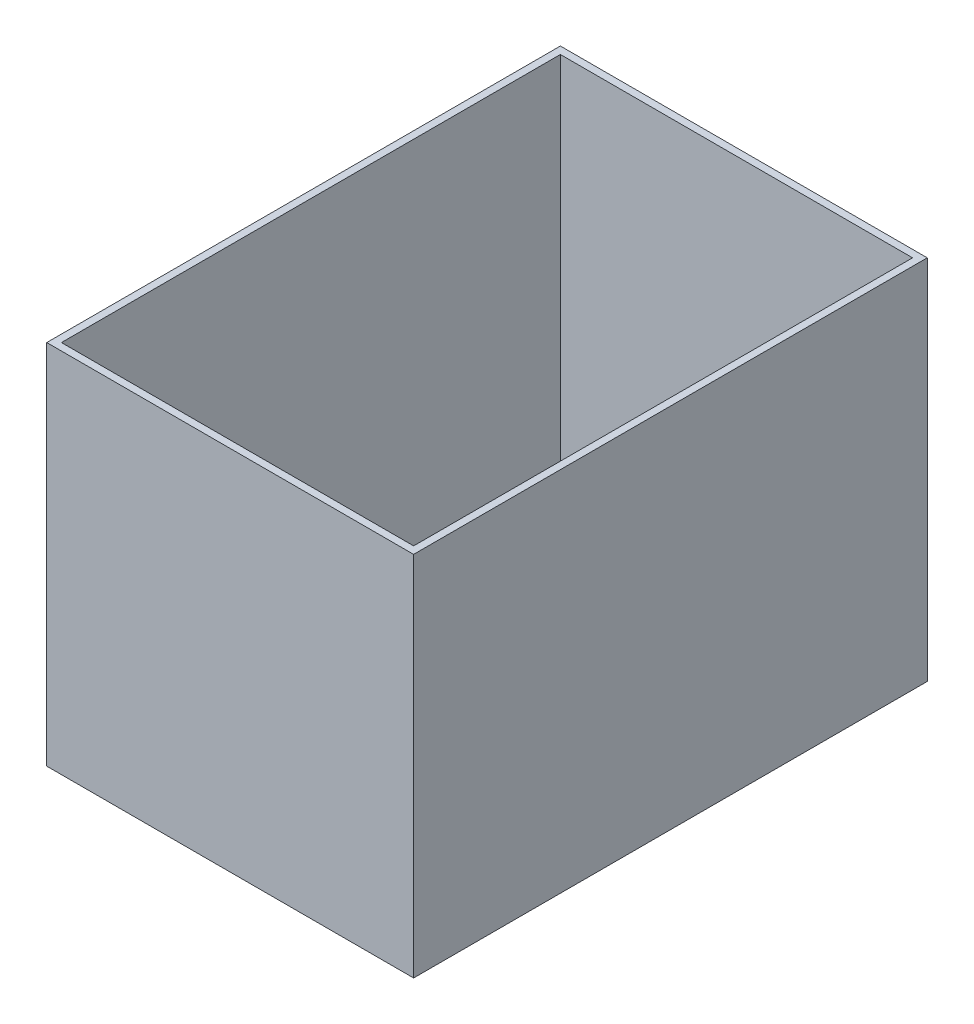
ISO-10303-21;
HEADER;
FILE_DESCRIPTION(('STEP AP214'),'2;1');
FILE_NAME('part.step','',(''),(''),'','','');
FILE_SCHEMA(('AUTOMOTIVE_DESIGN { 1 0 10303 214 1 1 1 1 }'));
ENDSEC;
DATA;
#1=APPLICATION_CONTEXT('core data for automotive mechanical design processes');
#2=APPLICATION_PROTOCOL_DEFINITION('international standard','automotive_design',2000,#1);
#3=PRODUCT_CONTEXT('',#1,'mechanical');
#4=PRODUCT('Part','Part','',(#3));
#5=PRODUCT_RELATED_PRODUCT_CATEGORY('part','',(#4));
#6=PRODUCT_DEFINITION_FORMATION('','',#4);
#7=PRODUCT_DEFINITION_CONTEXT('part definition',#1,'design');
#8=PRODUCT_DEFINITION('design','',#6,#7);
#9=PRODUCT_DEFINITION_SHAPE('','',#8);
#10=(LENGTH_UNIT() NAMED_UNIT(*) SI_UNIT(.MILLI.,.METRE.));
#11=(NAMED_UNIT(*) PLANE_ANGLE_UNIT() SI_UNIT($,.RADIAN.));
#12=(NAMED_UNIT(*) SI_UNIT($,.STERADIAN.) SOLID_ANGLE_UNIT());
#13=UNCERTAINTY_MEASURE_WITH_UNIT(LENGTH_MEASURE(1.E-05),#10,'distance_accuracy_value','');
#14=(GEOMETRIC_REPRESENTATION_CONTEXT(3) GLOBAL_UNCERTAINTY_ASSIGNED_CONTEXT((#13)) GLOBAL_UNIT_ASSIGNED_CONTEXT((#10,
#11,#12)) REPRESENTATION_CONTEXT('',''));
#15=CARTESIAN_POINT('',(0.,0.,0.));
#16=DIRECTION('',(0.,0.,1.));
#17=DIRECTION('',(1.,0.,0.));
#18=AXIS2_PLACEMENT_3D('',#15,#16,#17);
#19=CARTESIAN_POINT('',(250.,500.,-350.));
#20=DIRECTION('',(-1.,0.,0.));
#21=DIRECTION('',(0.,0.,1.));
#22=AXIS2_PLACEMENT_3D('',#19,#20,#21);
#23=PLANE('',#22);
#24=DIRECTION('',(0.,0.,-1.));
#25=VECTOR('',#24,1.);
#26=CARTESIAN_POINT('',(250.,0.,-350.));
#27=LINE('',#26,#25);
#28=CARTESIAN_POINT('',(250.,0.,350.));
#29=VERTEX_POINT('',#28);
#30=CARTESIAN_POINT('',(250.,0.,-350.));
#31=VERTEX_POINT('',#30);
#32=EDGE_CURVE('E171',#29,#31,#27,.T.);
#33=ORIENTED_EDGE('',*,*,#32,.T.);
#34=DIRECTION('',(0.,-1.,0.));
#35=VECTOR('',#34,1.);
#36=CARTESIAN_POINT('',(250.,500.,-350.));
#37=LINE('',#36,#35);
#38=CARTESIAN_POINT('',(250.,500.,-350.));
#39=VERTEX_POINT('',#38);
#40=EDGE_CURVE('E11',#39,#31,#37,.T.);
#41=ORIENTED_EDGE('',*,*,#40,.F.);
#42=DIRECTION('',(0.,0.,-1.));
#43=VECTOR('',#42,1.);
#44=CARTESIAN_POINT('',(250.,500.,-350.));
#45=LINE('',#44,#43);
#46=CARTESIAN_POINT('',(250.,500.,350.));
#47=VERTEX_POINT('',#46);
#48=EDGE_CURVE('E160',#47,#39,#45,.T.);
#49=ORIENTED_EDGE('',*,*,#48,.F.);
#50=DIRECTION('',(0.,-1.,0.));
#51=VECTOR('',#50,1.);
#52=CARTESIAN_POINT('',(250.,500.,350.));
#53=LINE('',#52,#51);
#54=EDGE_CURVE('E170',#47,#29,#53,.T.);
#55=ORIENTED_EDGE('',*,*,#54,.T.);
#56=EDGE_LOOP('',(#33,#41,#49,#55));
#57=FACE_BOUND('',#56,.T.);
#58=ADVANCED_FACE('F43',(#57),#23,.F.);
#59=CARTESIAN_POINT('',(-250.,500.,-350.));
#60=DIRECTION('',(0.,0.,1.));
#61=DIRECTION('',(1.,0.,0.));
#62=AXIS2_PLACEMENT_3D('',#59,#60,#61);
#63=PLANE('',#62);
#64=DIRECTION('',(-1.,0.,0.));
#65=VECTOR('',#64,1.);
#66=CARTESIAN_POINT('',(-250.,0.,-350.));
#67=LINE('',#66,#65);
#68=CARTESIAN_POINT('',(-250.,0.,-350.));
#69=VERTEX_POINT('',#68);
#70=EDGE_CURVE('E175',#31,#69,#67,.T.);
#71=ORIENTED_EDGE('',*,*,#70,.T.);
#72=DIRECTION('',(0.,-1.,0.));
#73=VECTOR('',#72,1.);
#74=CARTESIAN_POINT('',(-250.,500.,-350.));
#75=LINE('',#74,#73);
#76=CARTESIAN_POINT('',(-250.,500.,-350.));
#77=VERTEX_POINT('',#76);
#78=EDGE_CURVE('E51',#77,#69,#75,.T.);
#79=ORIENTED_EDGE('',*,*,#78,.F.);
#80=DIRECTION('',(-1.,0.,0.));
#81=VECTOR('',#80,1.);
#82=CARTESIAN_POINT('',(-250.,500.,-350.));
#83=LINE('',#82,#81);
#84=EDGE_CURVE('E95',#39,#77,#83,.T.);
#85=ORIENTED_EDGE('',*,*,#84,.F.);
#86=ORIENTED_EDGE('',*,*,#40,.T.);
#87=EDGE_LOOP('',(#71,#79,#85,#86));
#88=FACE_BOUND('',#87,.T.);
#89=ADVANCED_FACE('F210',(#88),#63,.F.);
#90=CARTESIAN_POINT('',(-250.,500.,-350.));
#91=DIRECTION('',(1.,0.,0.));
#92=DIRECTION('',(0.,0.,-1.));
#93=AXIS2_PLACEMENT_3D('',#90,#91,#92);
#94=PLANE('',#93);
#95=DIRECTION('',(0.,0.,1.));
#96=VECTOR('',#95,1.);
#97=CARTESIAN_POINT('',(-250.,0.,-350.));
#98=LINE('',#97,#96);
#99=CARTESIAN_POINT('',(-250.,0.,350.));
#100=VERTEX_POINT('',#99);
#101=EDGE_CURVE('E178',#69,#100,#98,.T.);
#102=ORIENTED_EDGE('',*,*,#101,.T.);
#103=DIRECTION('',(0.,-1.,0.));
#104=VECTOR('',#103,1.);
#105=CARTESIAN_POINT('',(-250.,500.,350.));
#106=LINE('',#105,#104);
#107=CARTESIAN_POINT('',(-250.,500.,350.));
#108=VERTEX_POINT('',#107);
#109=EDGE_CURVE('E185',#108,#100,#106,.T.);
#110=ORIENTED_EDGE('',*,*,#109,.F.);
#111=DIRECTION('',(0.,0.,1.));
#112=VECTOR('',#111,1.);
#113=CARTESIAN_POINT('',(-250.,500.,-350.));
#114=LINE('',#113,#112);
#115=EDGE_CURVE('E165',#77,#108,#114,.T.);
#116=ORIENTED_EDGE('',*,*,#115,.F.);
#117=ORIENTED_EDGE('',*,*,#78,.T.);
#118=EDGE_LOOP('',(#102,#110,#116,#117));
#119=FACE_BOUND('',#118,.T.);
#120=ADVANCED_FACE('F192',(#119),#94,.F.);
#121=CARTESIAN_POINT('',(-250.,500.,350.));
#122=DIRECTION('',(0.,0.,-1.));
#123=DIRECTION('',(-1.,0.,0.));
#124=AXIS2_PLACEMENT_3D('',#121,#122,#123);
#125=PLANE('',#124);
#126=DIRECTION('',(1.,0.,0.));
#127=VECTOR('',#126,1.);
#128=CARTESIAN_POINT('',(-250.,0.,350.));
#129=LINE('',#128,#127);
#130=EDGE_CURVE('E88',#100,#29,#129,.T.);
#131=ORIENTED_EDGE('',*,*,#130,.T.);
#132=ORIENTED_EDGE('',*,*,#54,.F.);
#133=DIRECTION('',(1.,0.,0.));
#134=VECTOR('',#133,1.);
#135=CARTESIAN_POINT('',(-250.,500.,350.));
#136=LINE('',#135,#134);
#137=EDGE_CURVE('E67',#108,#47,#136,.T.);
#138=ORIENTED_EDGE('',*,*,#137,.F.);
#139=ORIENTED_EDGE('',*,*,#109,.T.);
#140=EDGE_LOOP('',(#131,#132,#138,#139));
#141=FACE_BOUND('',#140,.T.);
#142=ADVANCED_FACE('F200',(#141),#125,.F.);
#143=CARTESIAN_POINT('',(0.,500.,0.));
#144=DIRECTION('',(0.,1.,0.));
#145=DIRECTION('',(0.,0.,1.));
#146=AXIS2_PLACEMENT_3D('',#143,#144,#145);
#147=PLANE('',#146);
#148=DIRECTION('',(0.,0.,-1.));
#149=VECTOR('',#148,1.);
#150=CARTESIAN_POINT('',(240.,500.,-350.));
#151=LINE('',#150,#149);
#152=CARTESIAN_POINT('',(240.,500.,340.));
#153=VERTEX_POINT('',#152);
#154=CARTESIAN_POINT('',(240.,500.,-340.));
#155=VERTEX_POINT('',#154);
#156=EDGE_CURVE('E144',#153,#155,#151,.T.);
#157=ORIENTED_EDGE('',*,*,#156,.F.);
#158=DIRECTION('',(1.,0.,0.));
#159=VECTOR('',#158,1.);
#160=CARTESIAN_POINT('',(-250.,500.,340.));
#161=LINE('',#160,#159);
#162=CARTESIAN_POINT('',(-240.,500.,340.));
#163=VERTEX_POINT('',#162);
#164=EDGE_CURVE('E157',#163,#153,#161,.T.);
#165=ORIENTED_EDGE('',*,*,#164,.F.);
#166=DIRECTION('',(0.,0.,1.));
#167=VECTOR('',#166,1.);
#168=CARTESIAN_POINT('',(-240.,500.,-350.));
#169=LINE('',#168,#167);
#170=CARTESIAN_POINT('',(-240.,500.,-340.));
#171=VERTEX_POINT('',#170);
#172=EDGE_CURVE('E154',#171,#163,#169,.T.);
#173=ORIENTED_EDGE('',*,*,#172,.F.);
#174=DIRECTION('',(-1.,0.,0.));
#175=VECTOR('',#174,1.);
#176=CARTESIAN_POINT('',(-250.,500.,-340.));
#177=LINE('',#176,#175);
#178=EDGE_CURVE('E133',#155,#171,#177,.T.);
#179=ORIENTED_EDGE('',*,*,#178,.F.);
#180=EDGE_LOOP('',(#157,#165,#173,#179));
#181=FACE_BOUND('',#180,.T.);
#182=ORIENTED_EDGE('',*,*,#48,.T.);
#183=ORIENTED_EDGE('',*,*,#84,.T.);
#184=ORIENTED_EDGE('',*,*,#115,.T.);
#185=ORIENTED_EDGE('',*,*,#137,.T.);
#186=EDGE_LOOP('',(#182,#183,#184,#185));
#187=FACE_BOUND('',#186,.T.);
#188=ADVANCED_FACE('F202',(#181,#187),#147,.T.);
#189=CARTESIAN_POINT('',(0.,0.,0.));
#190=DIRECTION('',(0.,1.,0.));
#191=DIRECTION('',(0.,0.,1.));
#192=AXIS2_PLACEMENT_3D('',#189,#190,#191);
#193=PLANE('',#192);
#194=ORIENTED_EDGE('',*,*,#32,.F.);
#195=ORIENTED_EDGE('',*,*,#130,.F.);
#196=ORIENTED_EDGE('',*,*,#101,.F.);
#197=ORIENTED_EDGE('',*,*,#70,.F.);
#198=EDGE_LOOP('',(#194,#195,#196,#197));
#199=FACE_BOUND('',#198,.T.);
#200=ADVANCED_FACE('F196',(#199),#193,.F.);
#201=CARTESIAN_POINT('',(240.,500.,-350.));
#202=DIRECTION('',(-1.,0.,0.));
#203=DIRECTION('',(0.,0.,1.));
#204=AXIS2_PLACEMENT_3D('',#201,#202,#203);
#205=PLANE('',#204);
#206=DIRECTION('',(0.,0.,-1.));
#207=VECTOR('',#206,1.);
#208=CARTESIAN_POINT('',(240.,10.,-350.));
#209=LINE('',#208,#207);
#210=CARTESIAN_POINT('',(240.,10.,340.));
#211=VERTEX_POINT('',#210);
#212=CARTESIAN_POINT('',(240.,10.,-340.));
#213=VERTEX_POINT('',#212);
#214=EDGE_CURVE('E123',#211,#213,#209,.T.);
#215=ORIENTED_EDGE('',*,*,#214,.F.);
#216=DIRECTION('',(0.,-1.,0.));
#217=VECTOR('',#216,1.);
#218=CARTESIAN_POINT('',(240.,500.,340.));
#219=LINE('',#218,#217);
#220=EDGE_CURVE('E148',#153,#211,#219,.T.);
#221=ORIENTED_EDGE('',*,*,#220,.F.);
#222=ORIENTED_EDGE('',*,*,#156,.T.);
#223=DIRECTION('',(0.,-1.,0.));
#224=VECTOR('',#223,1.);
#225=CARTESIAN_POINT('',(240.,500.,-340.));
#226=LINE('',#225,#224);
#227=EDGE_CURVE('E137',#155,#213,#226,.T.);
#228=ORIENTED_EDGE('',*,*,#227,.T.);
#229=EDGE_LOOP('',(#215,#221,#222,#228));
#230=FACE_BOUND('',#229,.T.);
#231=ADVANCED_FACE('F239',(#230),#205,.T.);
#232=CARTESIAN_POINT('',(-250.,500.,-340.));
#233=DIRECTION('',(0.,0.,1.));
#234=DIRECTION('',(1.,0.,0.));
#235=AXIS2_PLACEMENT_3D('',#232,#233,#234);
#236=PLANE('',#235);
#237=DIRECTION('',(-1.,0.,0.));
#238=VECTOR('',#237,1.);
#239=CARTESIAN_POINT('',(-250.,10.,-340.));
#240=LINE('',#239,#238);
#241=CARTESIAN_POINT('',(-240.,10.,-340.));
#242=VERTEX_POINT('',#241);
#243=EDGE_CURVE('E117',#213,#242,#240,.T.);
#244=ORIENTED_EDGE('',*,*,#243,.F.);
#245=ORIENTED_EDGE('',*,*,#227,.F.);
#246=ORIENTED_EDGE('',*,*,#178,.T.);
#247=DIRECTION('',(0.,-1.,0.));
#248=VECTOR('',#247,1.);
#249=CARTESIAN_POINT('',(-240.,500.,-340.));
#250=LINE('',#249,#248);
#251=EDGE_CURVE('E130',#171,#242,#250,.T.);
#252=ORIENTED_EDGE('',*,*,#251,.T.);
#253=EDGE_LOOP('',(#244,#245,#246,#252));
#254=FACE_BOUND('',#253,.T.);
#255=ADVANCED_FACE('F131',(#254),#236,.T.);
#256=CARTESIAN_POINT('',(-240.,500.,-350.));
#257=DIRECTION('',(1.,0.,0.));
#258=DIRECTION('',(0.,0.,-1.));
#259=AXIS2_PLACEMENT_3D('',#256,#257,#258);
#260=PLANE('',#259);
#261=DIRECTION('',(0.,0.,1.));
#262=VECTOR('',#261,1.);
#263=CARTESIAN_POINT('',(-240.,10.,-350.));
#264=LINE('',#263,#262);
#265=CARTESIAN_POINT('',(-240.,10.,340.));
#266=VERTEX_POINT('',#265);
#267=EDGE_CURVE('E121',#242,#266,#264,.T.);
#268=ORIENTED_EDGE('',*,*,#267,.F.);
#269=ORIENTED_EDGE('',*,*,#251,.F.);
#270=ORIENTED_EDGE('',*,*,#172,.T.);
#271=DIRECTION('',(0.,-1.,0.));
#272=VECTOR('',#271,1.);
#273=CARTESIAN_POINT('',(-240.,500.,340.));
#274=LINE('',#273,#272);
#275=EDGE_CURVE('E58',#163,#266,#274,.T.);
#276=ORIENTED_EDGE('',*,*,#275,.T.);
#277=EDGE_LOOP('',(#268,#269,#270,#276));
#278=FACE_BOUND('',#277,.T.);
#279=ADVANCED_FACE('F139',(#278),#260,.T.);
#280=CARTESIAN_POINT('',(-250.,500.,340.));
#281=DIRECTION('',(0.,0.,-1.));
#282=DIRECTION('',(-1.,0.,0.));
#283=AXIS2_PLACEMENT_3D('',#280,#281,#282);
#284=PLANE('',#283);
#285=DIRECTION('',(1.,0.,0.));
#286=VECTOR('',#285,1.);
#287=CARTESIAN_POINT('',(-250.,10.,340.));
#288=LINE('',#287,#286);
#289=EDGE_CURVE('E141',#266,#211,#288,.T.);
#290=ORIENTED_EDGE('',*,*,#289,.F.);
#291=ORIENTED_EDGE('',*,*,#275,.F.);
#292=ORIENTED_EDGE('',*,*,#164,.T.);
#293=ORIENTED_EDGE('',*,*,#220,.T.);
#294=EDGE_LOOP('',(#290,#291,#292,#293));
#295=FACE_BOUND('',#294,.T.);
#296=ADVANCED_FACE('F273',(#295),#284,.T.);
#297=CARTESIAN_POINT('',(0.,10.,0.));
#298=DIRECTION('',(0.,1.,0.));
#299=DIRECTION('',(0.,0.,1.));
#300=AXIS2_PLACEMENT_3D('',#297,#298,#299);
#301=PLANE('',#300);
#302=ORIENTED_EDGE('',*,*,#214,.T.);
#303=ORIENTED_EDGE('',*,*,#243,.T.);
#304=ORIENTED_EDGE('',*,*,#267,.T.);
#305=ORIENTED_EDGE('',*,*,#289,.T.);
#306=EDGE_LOOP('',(#302,#303,#304,#305));
#307=FACE_BOUND('',#306,.T.);
#308=ADVANCED_FACE('F119',(#307),#301,.T.);
#309=CLOSED_SHELL('',(#58,#89,#120,#142,#188,#200,#231,#255,#279,#296,#308));
#310=MANIFOLD_SOLID_BREP('B2',#309);
#311=ADVANCED_BREP_SHAPE_REPRESENTATION('',(#18,#310),#14);
#312=SHAPE_DEFINITION_REPRESENTATION(#9,#311);
ENDSEC;
END-ISO-10303-21;
